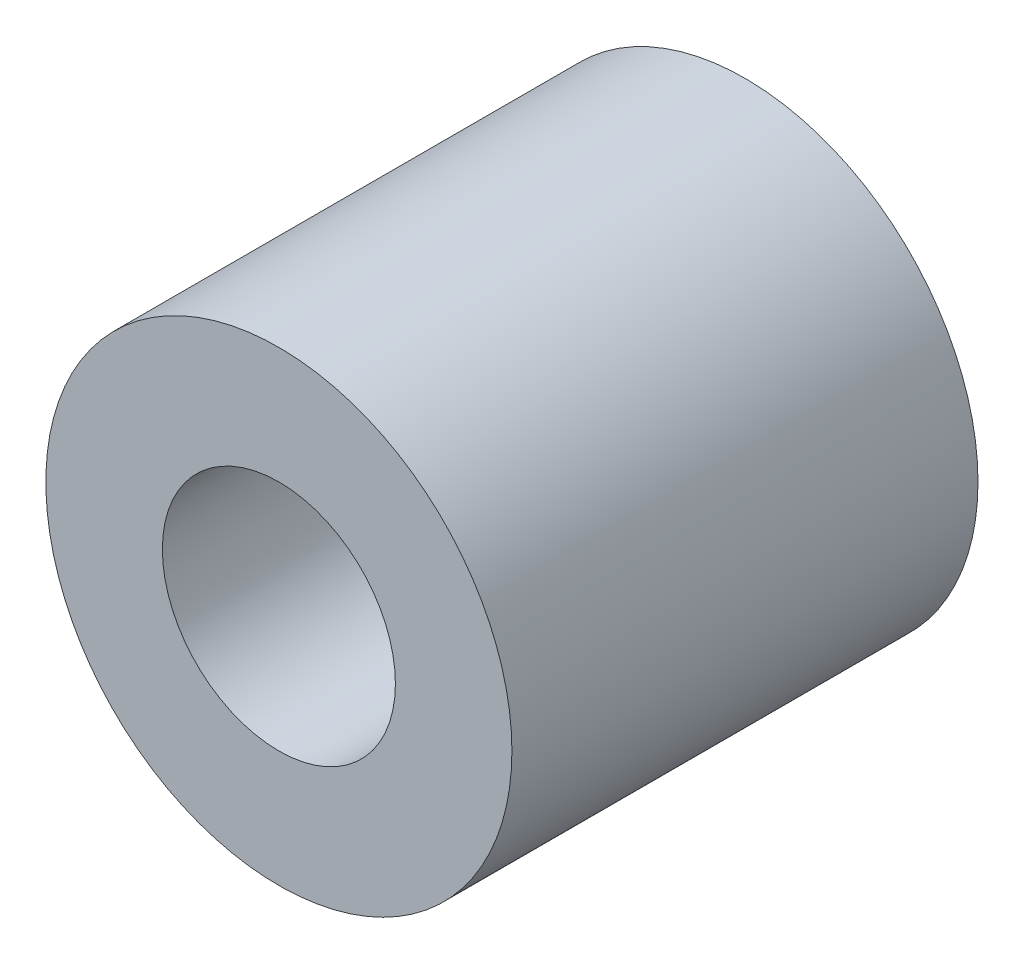
ISO-10303-21;
HEADER;
FILE_DESCRIPTION(('STEP AP214'),'2;1');
FILE_NAME('part.step','',(''),(''),'','','');
FILE_SCHEMA(('AUTOMOTIVE_DESIGN { 1 0 10303 214 1 1 1 1 }'));
ENDSEC;
DATA;
#1=APPLICATION_CONTEXT('core data for automotive mechanical design processes');
#2=APPLICATION_PROTOCOL_DEFINITION('international standard','automotive_design',2000,#1);
#3=PRODUCT_CONTEXT('',#1,'mechanical');
#4=PRODUCT('Part','Part','',(#3));
#5=PRODUCT_RELATED_PRODUCT_CATEGORY('part','',(#4));
#6=PRODUCT_DEFINITION_FORMATION('','',#4);
#7=PRODUCT_DEFINITION_CONTEXT('part definition',#1,'design');
#8=PRODUCT_DEFINITION('design','',#6,#7);
#9=PRODUCT_DEFINITION_SHAPE('','',#8);
#10=(LENGTH_UNIT() NAMED_UNIT(*) SI_UNIT(.MILLI.,.METRE.));
#11=(NAMED_UNIT(*) PLANE_ANGLE_UNIT() SI_UNIT($,.RADIAN.));
#12=(NAMED_UNIT(*) SI_UNIT($,.STERADIAN.) SOLID_ANGLE_UNIT());
#13=UNCERTAINTY_MEASURE_WITH_UNIT(LENGTH_MEASURE(1.E-05),#10,'distance_accuracy_value','');
#14=(GEOMETRIC_REPRESENTATION_CONTEXT(3) GLOBAL_UNCERTAINTY_ASSIGNED_CONTEXT((#13)) GLOBAL_UNIT_ASSIGNED_CONTEXT((#10,
#11,#12)) REPRESENTATION_CONTEXT('',''));
#15=CARTESIAN_POINT('',(0.,0.,0.));
#16=DIRECTION('',(0.,0.,1.));
#17=DIRECTION('',(1.,0.,0.));
#18=AXIS2_PLACEMENT_3D('',#15,#16,#17);
#19=CARTESIAN_POINT('',(-27.5486832410967,9.61142948633817,12.7));
#20=DIRECTION('',(0.,0.,1.));
#21=DIRECTION('',(1.,0.,0.));
#22=AXIS2_PLACEMENT_3D('',#19,#20,#21);
#23=PLANE('',#22);
#24=CARTESIAN_POINT('',(-27.5486832410967,9.61142948633817,12.7));
#25=DIRECTION('',(0.,0.,1.));
#26=DIRECTION('',(1.,0.,0.));
#27=AXIS2_PLACEMENT_3D('',#24,#25,#26);
#28=CIRCLE('',#27,6.35);
#29=CARTESIAN_POINT('',(-21.1986832410967,9.61142948633817,12.7));
#30=VERTEX_POINT('',#29);
#31=EDGE_CURVE('E10',#30,#30,#28,.T.);
#32=ORIENTED_EDGE('',*,*,#31,.T.);
#33=EDGE_LOOP('',(#32));
#34=FACE_BOUND('',#33,.T.);
#35=CARTESIAN_POINT('',(-27.5486832410967,9.61142948633817,12.7));
#36=DIRECTION('',(0.,0.,1.));
#37=DIRECTION('',(1.,0.,0.));
#38=AXIS2_PLACEMENT_3D('',#35,#36,#37);
#39=CIRCLE('',#38,3.175);
#40=CARTESIAN_POINT('',(-24.3736832410967,9.61142948633817,12.7));
#41=VERTEX_POINT('',#40);
#42=EDGE_CURVE('E49',#41,#41,#39,.T.);
#43=ORIENTED_EDGE('',*,*,#42,.F.);
#44=EDGE_LOOP('',(#43));
#45=FACE_BOUND('',#44,.T.);
#46=ADVANCED_FACE('F38',(#34,#45),#23,.T.);
#47=CARTESIAN_POINT('',(-27.5486832410967,9.61142948633817,0.));
#48=DIRECTION('',(0.,0.,1.));
#49=DIRECTION('',(1.,0.,0.));
#50=AXIS2_PLACEMENT_3D('',#47,#48,#49);
#51=PLANE('',#50);
#52=CARTESIAN_POINT('',(-27.5486832410967,9.61142948633817,0.));
#53=DIRECTION('',(0.,0.,1.));
#54=DIRECTION('',(1.,0.,0.));
#55=AXIS2_PLACEMENT_3D('',#52,#53,#54);
#56=CIRCLE('',#55,6.35);
#57=CARTESIAN_POINT('',(-21.1986832410967,9.61142948633817,0.));
#58=VERTEX_POINT('',#57);
#59=EDGE_CURVE('E42',#58,#58,#56,.T.);
#60=ORIENTED_EDGE('',*,*,#59,.F.);
#61=EDGE_LOOP('',(#60));
#62=FACE_BOUND('',#61,.T.);
#63=CARTESIAN_POINT('',(-27.5486832410967,9.61142948633817,0.));
#64=DIRECTION('',(0.,0.,1.));
#65=DIRECTION('',(1.,0.,0.));
#66=AXIS2_PLACEMENT_3D('',#63,#64,#65);
#67=CIRCLE('',#66,3.175);
#68=CARTESIAN_POINT('',(-24.3736832410967,9.61142948633817,0.));
#69=VERTEX_POINT('',#68);
#70=EDGE_CURVE('E51',#69,#69,#67,.T.);
#71=ORIENTED_EDGE('',*,*,#70,.T.);
#72=EDGE_LOOP('',(#71));
#73=FACE_BOUND('',#72,.T.);
#74=ADVANCED_FACE('F61',(#62,#73),#51,.F.);
#75=CARTESIAN_POINT('',(-27.5486832410967,9.61142948633817,12.7));
#76=DIRECTION('',(0.,0.,-1.));
#77=DIRECTION('',(-1.,0.,0.));
#78=AXIS2_PLACEMENT_3D('',#75,#76,#77);
#79=CYLINDRICAL_SURFACE('',#78,6.35);
#80=ORIENTED_EDGE('',*,*,#31,.F.);
#81=EDGE_LOOP('',(#80));
#82=FACE_BOUND('',#81,.T.);
#83=ORIENTED_EDGE('',*,*,#59,.T.);
#84=EDGE_LOOP('',(#83));
#85=FACE_BOUND('',#84,.T.);
#86=ADVANCED_FACE('F40',(#82,#85),#79,.T.);
#87=CARTESIAN_POINT('',(-27.5486832410967,9.61142948633817,12.7));
#88=DIRECTION('',(0.,0.,-1.));
#89=DIRECTION('',(-1.,0.,0.));
#90=AXIS2_PLACEMENT_3D('',#87,#88,#89);
#91=CYLINDRICAL_SURFACE('',#90,3.175);
#92=ORIENTED_EDGE('',*,*,#42,.T.);
#93=EDGE_LOOP('',(#92));
#94=FACE_BOUND('',#93,.T.);
#95=ORIENTED_EDGE('',*,*,#70,.F.);
#96=EDGE_LOOP('',(#95));
#97=FACE_BOUND('',#96,.T.);
#98=ADVANCED_FACE('F57',(#94,#97),#91,.F.);
#99=CLOSED_SHELL('',(#46,#74,#86,#98));
#100=MANIFOLD_SOLID_BREP('B2',#99);
#101=ADVANCED_BREP_SHAPE_REPRESENTATION('',(#18,#100),#14);
#102=SHAPE_DEFINITION_REPRESENTATION(#9,#101);
ENDSEC;
END-ISO-10303-21;
